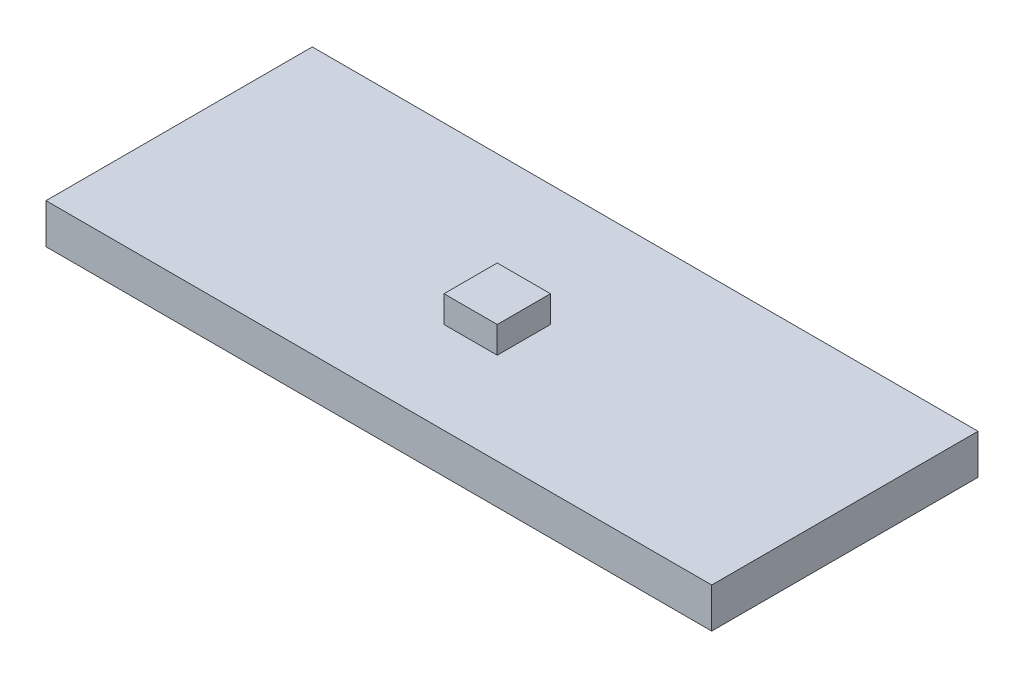
ISO-10303-21;
HEADER;
FILE_DESCRIPTION(('STEP AP214'),'2;1');
FILE_NAME('part.step','',(''),(''),'','','');
FILE_SCHEMA(('AUTOMOTIVE_DESIGN { 1 0 10303 214 1 1 1 1 }'));
ENDSEC;
DATA;
#1=APPLICATION_CONTEXT('core data for automotive mechanical design processes');
#2=APPLICATION_PROTOCOL_DEFINITION('international standard','automotive_design',2000,#1);
#3=PRODUCT_CONTEXT('',#1,'mechanical');
#4=PRODUCT('Part','Part','',(#3));
#5=PRODUCT_RELATED_PRODUCT_CATEGORY('part','',(#4));
#6=PRODUCT_DEFINITION_FORMATION('','',#4);
#7=PRODUCT_DEFINITION_CONTEXT('part definition',#1,'design');
#8=PRODUCT_DEFINITION('design','',#6,#7);
#9=PRODUCT_DEFINITION_SHAPE('','',#8);
#10=(LENGTH_UNIT() NAMED_UNIT(*) SI_UNIT(.MILLI.,.METRE.));
#11=(NAMED_UNIT(*) PLANE_ANGLE_UNIT() SI_UNIT($,.RADIAN.));
#12=(NAMED_UNIT(*) SI_UNIT($,.STERADIAN.) SOLID_ANGLE_UNIT());
#13=UNCERTAINTY_MEASURE_WITH_UNIT(LENGTH_MEASURE(1.E-05),#10,'distance_accuracy_value','');
#14=(GEOMETRIC_REPRESENTATION_CONTEXT(3) GLOBAL_UNCERTAINTY_ASSIGNED_CONTEXT((#13)) GLOBAL_UNIT_ASSIGNED_CONTEXT((#10,
#11,#12)) REPRESENTATION_CONTEXT('',''));
#15=CARTESIAN_POINT('',(0.,0.,0.));
#16=DIRECTION('',(0.,0.,1.));
#17=DIRECTION('',(1.,0.,0.));
#18=AXIS2_PLACEMENT_3D('',#15,#16,#17);
#19=CARTESIAN_POINT('',(0.,1.5,0.));
#20=DIRECTION('',(0.,-1.,0.));
#21=DIRECTION('',(0.,0.,-1.));
#22=AXIS2_PLACEMENT_3D('',#19,#20,#21);
#23=PLANE('',#22);
#24=DIRECTION('',(0.,0.,1.));
#25=VECTOR('',#24,1.);
#26=CARTESIAN_POINT('',(0.,1.5,0.));
#27=LINE('',#26,#25);
#28=CARTESIAN_POINT('',(0.,1.5,-10.));
#29=VERTEX_POINT('',#28);
#30=CARTESIAN_POINT('',(0.,1.5,0.));
#31=VERTEX_POINT('',#30);
#32=EDGE_CURVE('E134',#29,#31,#27,.T.);
#33=ORIENTED_EDGE('',*,*,#32,.T.);
#34=DIRECTION('',(1.,0.,0.));
#35=VECTOR('',#34,1.);
#36=CARTESIAN_POINT('',(0.,1.5,0.));
#37=LINE('',#36,#35);
#38=CARTESIAN_POINT('',(25.,1.5,0.));
#39=VERTEX_POINT('',#38);
#40=EDGE_CURVE('E137',#31,#39,#37,.T.);
#41=ORIENTED_EDGE('',*,*,#40,.T.);
#42=DIRECTION('',(0.,0.,-1.));
#43=VECTOR('',#42,1.);
#44=CARTESIAN_POINT('',(25.,1.5,0.));
#45=LINE('',#44,#43);
#46=CARTESIAN_POINT('',(25.,1.5,-10.));
#47=VERTEX_POINT('',#46);
#48=EDGE_CURVE('E140',#39,#47,#45,.T.);
#49=ORIENTED_EDGE('',*,*,#48,.T.);
#50=DIRECTION('',(-1.,0.,0.));
#51=VECTOR('',#50,1.);
#52=CARTESIAN_POINT('',(0.,1.5,-10.));
#53=LINE('',#52,#51);
#54=EDGE_CURVE('E142',#47,#29,#53,.T.);
#55=ORIENTED_EDGE('',*,*,#54,.T.);
#56=EDGE_LOOP('',(#33,#41,#49,#55));
#57=FACE_BOUND('',#56,.T.);
#58=DIRECTION('',(0.,0.,1.));
#59=VECTOR('',#58,1.);
#60=CARTESIAN_POINT('',(11.5,1.5,-3.44531490193882));
#61=LINE('',#60,#59);
#62=CARTESIAN_POINT('',(11.5,1.5,-5.44531490193882));
#63=VERTEX_POINT('',#62);
#64=CARTESIAN_POINT('',(11.5,1.5,-3.44531490193882));
#65=VERTEX_POINT('',#64);
#66=EDGE_CURVE('E298',#63,#65,#61,.T.);
#67=ORIENTED_EDGE('',*,*,#66,.F.);
#68=DIRECTION('',(-1.,0.,0.));
#69=VECTOR('',#68,1.);
#70=CARTESIAN_POINT('',(12.5,1.5,-5.44531490193882));
#71=LINE('',#70,#69);
#72=CARTESIAN_POINT('',(13.5,1.5,-5.44531490193882));
#73=VERTEX_POINT('',#72);
#74=EDGE_CURVE('E121',#73,#63,#71,.T.);
#75=ORIENTED_EDGE('',*,*,#74,.F.);
#76=DIRECTION('',(0.,0.,-1.));
#77=VECTOR('',#76,1.);
#78=CARTESIAN_POINT('',(13.5,1.5,-5.44531490193882));
#79=LINE('',#78,#77);
#80=CARTESIAN_POINT('',(13.5,1.5,-3.44531490193882));
#81=VERTEX_POINT('',#80);
#82=EDGE_CURVE('E59',#81,#73,#79,.T.);
#83=ORIENTED_EDGE('',*,*,#82,.F.);
#84=DIRECTION('',(1.,0.,0.));
#85=VECTOR('',#84,1.);
#86=CARTESIAN_POINT('',(13.5,1.5,-3.44531490193882));
#87=LINE('',#86,#85);
#88=EDGE_CURVE('E54',#65,#81,#87,.T.);
#89=ORIENTED_EDGE('',*,*,#88,.F.);
#90=EDGE_LOOP('',(#67,#75,#83,#89));
#91=FACE_BOUND('',#90,.T.);
#92=ADVANCED_FACE('F39',(#57,#91),#23,.F.);
#93=CARTESIAN_POINT('',(0.,1.5,0.));
#94=DIRECTION('',(1.,0.,0.));
#95=DIRECTION('',(0.,0.,-1.));
#96=AXIS2_PLACEMENT_3D('',#93,#94,#95);
#97=PLANE('',#96);
#98=DIRECTION('',(0.,0.,1.));
#99=VECTOR('',#98,1.);
#100=CARTESIAN_POINT('',(0.,0.,0.));
#101=LINE('',#100,#99);
#102=CARTESIAN_POINT('',(0.,0.,-10.));
#103=VERTEX_POINT('',#102);
#104=CARTESIAN_POINT('',(0.,0.,0.));
#105=VERTEX_POINT('',#104);
#106=EDGE_CURVE('E125',#103,#105,#101,.T.);
#107=ORIENTED_EDGE('',*,*,#106,.T.);
#108=DIRECTION('',(0.,-1.,0.));
#109=VECTOR('',#108,1.);
#110=CARTESIAN_POINT('',(0.,1.5,0.));
#111=LINE('',#110,#109);
#112=EDGE_CURVE('E11',#31,#105,#111,.T.);
#113=ORIENTED_EDGE('',*,*,#112,.F.);
#114=ORIENTED_EDGE('',*,*,#32,.F.);
#115=DIRECTION('',(0.,-1.,0.));
#116=VECTOR('',#115,1.);
#117=CARTESIAN_POINT('',(0.,1.5,-10.));
#118=LINE('',#117,#116);
#119=EDGE_CURVE('E143',#29,#103,#118,.T.);
#120=ORIENTED_EDGE('',*,*,#119,.T.);
#121=EDGE_LOOP('',(#107,#113,#114,#120));
#122=FACE_BOUND('',#121,.T.);
#123=ADVANCED_FACE('F41',(#122),#97,.F.);
#124=CARTESIAN_POINT('',(0.,1.5,0.));
#125=DIRECTION('',(0.,0.,-1.));
#126=DIRECTION('',(-1.,0.,0.));
#127=AXIS2_PLACEMENT_3D('',#124,#125,#126);
#128=PLANE('',#127);
#129=DIRECTION('',(1.,0.,0.));
#130=VECTOR('',#129,1.);
#131=CARTESIAN_POINT('',(0.,0.,0.));
#132=LINE('',#131,#130);
#133=CARTESIAN_POINT('',(25.,0.,0.));
#134=VERTEX_POINT('',#133);
#135=EDGE_CURVE('E128',#105,#134,#132,.T.);
#136=ORIENTED_EDGE('',*,*,#135,.T.);
#137=DIRECTION('',(0.,-1.,0.));
#138=VECTOR('',#137,1.);
#139=CARTESIAN_POINT('',(25.,1.5,0.));
#140=LINE('',#139,#138);
#141=EDGE_CURVE('E47',#39,#134,#140,.T.);
#142=ORIENTED_EDGE('',*,*,#141,.F.);
#143=ORIENTED_EDGE('',*,*,#40,.F.);
#144=ORIENTED_EDGE('',*,*,#112,.T.);
#145=EDGE_LOOP('',(#136,#142,#143,#144));
#146=FACE_BOUND('',#145,.T.);
#147=ADVANCED_FACE('F173',(#146),#128,.F.);
#148=CARTESIAN_POINT('',(25.,1.5,0.));
#149=DIRECTION('',(-1.,0.,0.));
#150=DIRECTION('',(0.,0.,1.));
#151=AXIS2_PLACEMENT_3D('',#148,#149,#150);
#152=PLANE('',#151);
#153=DIRECTION('',(0.,0.,-1.));
#154=VECTOR('',#153,1.);
#155=CARTESIAN_POINT('',(25.,0.,0.));
#156=LINE('',#155,#154);
#157=CARTESIAN_POINT('',(25.,0.,-10.));
#158=VERTEX_POINT('',#157);
#159=EDGE_CURVE('E146',#134,#158,#156,.T.);
#160=ORIENTED_EDGE('',*,*,#159,.T.);
#161=DIRECTION('',(0.,-1.,0.));
#162=VECTOR('',#161,1.);
#163=CARTESIAN_POINT('',(25.,1.5,-10.));
#164=LINE('',#163,#162);
#165=EDGE_CURVE('E151',#47,#158,#164,.T.);
#166=ORIENTED_EDGE('',*,*,#165,.F.);
#167=ORIENTED_EDGE('',*,*,#48,.F.);
#168=ORIENTED_EDGE('',*,*,#141,.T.);
#169=EDGE_LOOP('',(#160,#166,#167,#168));
#170=FACE_BOUND('',#169,.T.);
#171=ADVANCED_FACE('F158',(#170),#152,.F.);
#172=CARTESIAN_POINT('',(0.,1.5,-10.));
#173=DIRECTION('',(0.,0.,1.));
#174=DIRECTION('',(1.,0.,0.));
#175=AXIS2_PLACEMENT_3D('',#172,#173,#174);
#176=PLANE('',#175);
#177=DIRECTION('',(-1.,0.,0.));
#178=VECTOR('',#177,1.);
#179=CARTESIAN_POINT('',(0.,0.,-10.));
#180=LINE('',#179,#178);
#181=EDGE_CURVE('E138',#158,#103,#180,.T.);
#182=ORIENTED_EDGE('',*,*,#181,.T.);
#183=ORIENTED_EDGE('',*,*,#119,.F.);
#184=ORIENTED_EDGE('',*,*,#54,.F.);
#185=ORIENTED_EDGE('',*,*,#165,.T.);
#186=EDGE_LOOP('',(#182,#183,#184,#185));
#187=FACE_BOUND('',#186,.T.);
#188=ADVANCED_FACE('F167',(#187),#176,.F.);
#189=CARTESIAN_POINT('',(0.,0.,0.));
#190=DIRECTION('',(0.,-1.,0.));
#191=DIRECTION('',(0.,0.,-1.));
#192=AXIS2_PLACEMENT_3D('',#189,#190,#191);
#193=PLANE('',#192);
#194=ORIENTED_EDGE('',*,*,#106,.F.);
#195=ORIENTED_EDGE('',*,*,#181,.F.);
#196=ORIENTED_EDGE('',*,*,#159,.F.);
#197=ORIENTED_EDGE('',*,*,#135,.F.);
#198=EDGE_LOOP('',(#194,#195,#196,#197));
#199=FACE_BOUND('',#198,.T.);
#200=ADVANCED_FACE('F164',(#199),#193,.T.);
#201=CARTESIAN_POINT('',(11.5,2.5,-3.44531490193882));
#202=DIRECTION('',(1.,0.,0.));
#203=DIRECTION('',(0.,0.,-1.));
#204=AXIS2_PLACEMENT_3D('',#201,#202,#203);
#205=PLANE('',#204);
#206=ORIENTED_EDGE('',*,*,#66,.T.);
#207=DIRECTION('',(0.,-1.,0.));
#208=VECTOR('',#207,1.);
#209=CARTESIAN_POINT('',(11.5,2.5,-3.44531490193882));
#210=LINE('',#209,#208);
#211=CARTESIAN_POINT('',(11.5,2.5,-3.44531490193882));
#212=VERTEX_POINT('',#211);
#213=EDGE_CURVE('E108',#212,#65,#210,.T.);
#214=ORIENTED_EDGE('',*,*,#213,.F.);
#215=DIRECTION('',(0.,0.,1.));
#216=VECTOR('',#215,1.);
#217=CARTESIAN_POINT('',(11.5,2.5,-3.44531490193882));
#218=LINE('',#217,#216);
#219=CARTESIAN_POINT('',(11.5,2.5,-5.44531490193882));
#220=VERTEX_POINT('',#219);
#221=EDGE_CURVE('E102',#220,#212,#218,.T.);
#222=ORIENTED_EDGE('',*,*,#221,.F.);
#223=DIRECTION('',(0.,-1.,0.));
#224=VECTOR('',#223,1.);
#225=CARTESIAN_POINT('',(11.5,2.5,-5.44531490193882));
#226=LINE('',#225,#224);
#227=EDGE_CURVE('E106',#220,#63,#226,.T.);
#228=ORIENTED_EDGE('',*,*,#227,.T.);
#229=EDGE_LOOP('',(#206,#214,#222,#228));
#230=FACE_BOUND('',#229,.T.);
#231=ADVANCED_FACE('F104',(#230),#205,.F.);
#232=CARTESIAN_POINT('',(13.5,2.5,-3.44531490193882));
#233=DIRECTION('',(0.,0.,-1.));
#234=DIRECTION('',(-1.,0.,0.));
#235=AXIS2_PLACEMENT_3D('',#232,#233,#234);
#236=PLANE('',#235);
#237=ORIENTED_EDGE('',*,*,#88,.T.);
#238=DIRECTION('',(0.,-1.,0.));
#239=VECTOR('',#238,1.);
#240=CARTESIAN_POINT('',(13.5,2.5,-3.44531490193882));
#241=LINE('',#240,#239);
#242=CARTESIAN_POINT('',(13.5,2.5,-3.44531490193882));
#243=VERTEX_POINT('',#242);
#244=EDGE_CURVE('E130',#243,#81,#241,.T.);
#245=ORIENTED_EDGE('',*,*,#244,.F.);
#246=DIRECTION('',(1.,0.,0.));
#247=VECTOR('',#246,1.);
#248=CARTESIAN_POINT('',(13.5,2.5,-3.44531490193882));
#249=LINE('',#248,#247);
#250=EDGE_CURVE('E111',#212,#243,#249,.T.);
#251=ORIENTED_EDGE('',*,*,#250,.F.);
#252=ORIENTED_EDGE('',*,*,#213,.T.);
#253=EDGE_LOOP('',(#237,#245,#251,#252));
#254=FACE_BOUND('',#253,.T.);
#255=ADVANCED_FACE('F204',(#254),#236,.F.);
#256=CARTESIAN_POINT('',(13.5,2.5,-5.44531490193882));
#257=DIRECTION('',(-1.,0.,0.));
#258=DIRECTION('',(0.,0.,1.));
#259=AXIS2_PLACEMENT_3D('',#256,#257,#258);
#260=PLANE('',#259);
#261=ORIENTED_EDGE('',*,*,#82,.T.);
#262=DIRECTION('',(0.,-1.,0.));
#263=VECTOR('',#262,1.);
#264=CARTESIAN_POINT('',(13.5,2.5,-5.44531490193882));
#265=LINE('',#264,#263);
#266=CARTESIAN_POINT('',(13.5,2.5,-5.44531490193882));
#267=VERTEX_POINT('',#266);
#268=EDGE_CURVE('E290',#267,#73,#265,.T.);
#269=ORIENTED_EDGE('',*,*,#268,.F.);
#270=DIRECTION('',(0.,0.,-1.));
#271=VECTOR('',#270,1.);
#272=CARTESIAN_POINT('',(13.5,2.5,-5.44531490193882));
#273=LINE('',#272,#271);
#274=EDGE_CURVE('E117',#243,#267,#273,.T.);
#275=ORIENTED_EDGE('',*,*,#274,.F.);
#276=ORIENTED_EDGE('',*,*,#244,.T.);
#277=EDGE_LOOP('',(#261,#269,#275,#276));
#278=FACE_BOUND('',#277,.T.);
#279=ADVANCED_FACE('F210',(#278),#260,.F.);
#280=CARTESIAN_POINT('',(12.5,2.5,-5.44531490193882));
#281=DIRECTION('',(0.,0.,1.));
#282=DIRECTION('',(1.,0.,0.));
#283=AXIS2_PLACEMENT_3D('',#280,#281,#282);
#284=PLANE('',#283);
#285=ORIENTED_EDGE('',*,*,#74,.T.);
#286=ORIENTED_EDGE('',*,*,#227,.F.);
#287=DIRECTION('',(-1.,0.,0.));
#288=VECTOR('',#287,1.);
#289=CARTESIAN_POINT('',(11.5,2.5,-5.44531490193882));
#290=LINE('',#289,#288);
#291=EDGE_CURVE('E112',#267,#220,#290,.T.);
#292=ORIENTED_EDGE('',*,*,#291,.F.);
#293=ORIENTED_EDGE('',*,*,#268,.T.);
#294=EDGE_LOOP('',(#285,#286,#292,#293));
#295=FACE_BOUND('',#294,.T.);
#296=ADVANCED_FACE('F124',(#295),#284,.F.);
#297=CARTESIAN_POINT('',(0.,2.5,0.));
#298=DIRECTION('',(0.,-1.,0.));
#299=DIRECTION('',(0.,0.,-1.));
#300=AXIS2_PLACEMENT_3D('',#297,#298,#299);
#301=PLANE('',#300);
#302=ORIENTED_EDGE('',*,*,#291,.T.);
#303=ORIENTED_EDGE('',*,*,#221,.T.);
#304=ORIENTED_EDGE('',*,*,#250,.T.);
#305=ORIENTED_EDGE('',*,*,#274,.T.);
#306=EDGE_LOOP('',(#302,#303,#304,#305));
#307=FACE_BOUND('',#306,.T.);
#308=ADVANCED_FACE('F115',(#307),#301,.F.);
#309=CLOSED_SHELL('',(#92,#123,#147,#171,#188,#200,#231,#255,#279,#296,#308));
#310=MANIFOLD_SOLID_BREP('B2',#309);
#311=ADVANCED_BREP_SHAPE_REPRESENTATION('',(#18,#310),#14);
#312=SHAPE_DEFINITION_REPRESENTATION(#9,#311);
ENDSEC;
END-ISO-10303-21;
